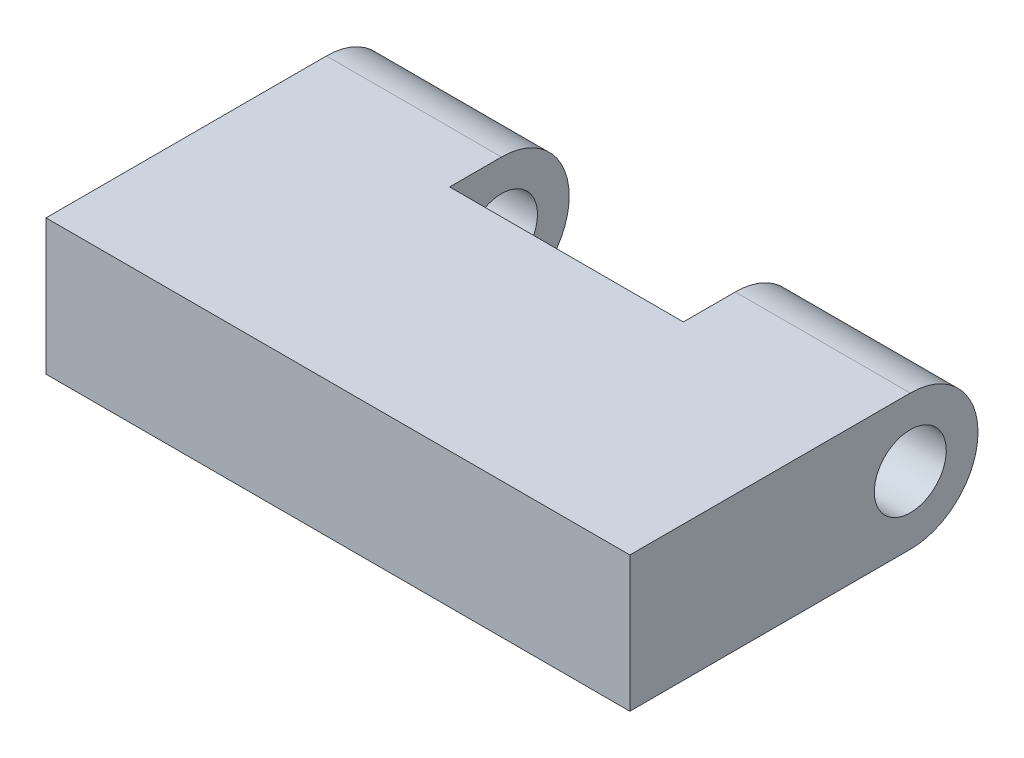
ISO-10303-21;
HEADER;
FILE_DESCRIPTION(('STEP AP214'),'2;1');
FILE_NAME('part.step','',(''),(''),'','','');
FILE_SCHEMA(('AUTOMOTIVE_DESIGN { 1 0 10303 214 1 1 1 1 }'));
ENDSEC;
DATA;
#1=APPLICATION_CONTEXT('core data for automotive mechanical design processes');
#2=APPLICATION_PROTOCOL_DEFINITION('international standard','automotive_design',2000,#1);
#3=PRODUCT_CONTEXT('',#1,'mechanical');
#4=PRODUCT('Part','Part','',(#3));
#5=PRODUCT_RELATED_PRODUCT_CATEGORY('part','',(#4));
#6=PRODUCT_DEFINITION_FORMATION('','',#4);
#7=PRODUCT_DEFINITION_CONTEXT('part definition',#1,'design');
#8=PRODUCT_DEFINITION('design','',#6,#7);
#9=PRODUCT_DEFINITION_SHAPE('','',#8);
#10=(LENGTH_UNIT() NAMED_UNIT(*) SI_UNIT(.MILLI.,.METRE.));
#11=(NAMED_UNIT(*) PLANE_ANGLE_UNIT() SI_UNIT($,.RADIAN.));
#12=(NAMED_UNIT(*) SI_UNIT($,.STERADIAN.) SOLID_ANGLE_UNIT());
#13=UNCERTAINTY_MEASURE_WITH_UNIT(LENGTH_MEASURE(1.E-05),#10,'distance_accuracy_value','');
#14=(GEOMETRIC_REPRESENTATION_CONTEXT(3) GLOBAL_UNCERTAINTY_ASSIGNED_CONTEXT((#13)) GLOBAL_UNIT_ASSIGNED_CONTEXT((#10,
#11,#12)) REPRESENTATION_CONTEXT('',''));
#15=CARTESIAN_POINT('',(0.,0.,0.));
#16=DIRECTION('',(0.,0.,1.));
#17=DIRECTION('',(1.,0.,0.));
#18=AXIS2_PLACEMENT_3D('',#15,#16,#17);
#19=CARTESIAN_POINT('',(6.67809582843404,17.5769670723901,-2.06915156237386));
#20=DIRECTION('',(1.,0.,0.));
#21=DIRECTION('',(0.,1.,0.));
#22=AXIS2_PLACEMENT_3D('',#19,#20,#21);
#23=PLANE('',#22);
#24=CARTESIAN_POINT('',(6.67809582843404,17.5769670723901,-2.06915156237386));
#25=DIRECTION('',(1.,0.,0.));
#26=DIRECTION('',(0.,1.,0.));
#27=AXIS2_PLACEMENT_3D('',#24,#25,#26);
#28=CIRCLE('',#27,2.05553129236809);
#29=CARTESIAN_POINT('',(6.67809582843404,19.6324983647582,-2.06915156237386));
#30=VERTEX_POINT('',#29);
#31=EDGE_CURVE('E149',#30,#30,#28,.T.);
#32=ORIENTED_EDGE('',*,*,#31,.T.);
#33=EDGE_LOOP('',(#32));
#34=FACE_BOUND('',#33,.T.);
#35=DIRECTION('',(0.,-1.,0.));
#36=VECTOR('',#35,1.);
#37=CARTESIAN_POINT('',(6.67809582843404,13.7097679309726,0.894908454199594));
#38=LINE('',#37,#36);
#39=CARTESIAN_POINT('',(6.67809582843404,21.4441662138076,0.894908454199594));
#40=VERTEX_POINT('',#39);
#41=CARTESIAN_POINT('',(6.67809582843404,13.7097679309726,0.894908454199594));
#42=VERTEX_POINT('',#41);
#43=EDGE_CURVE('E48',#40,#42,#38,.T.);
#44=ORIENTED_EDGE('',*,*,#43,.F.);
#45=DIRECTION('',(0.,0.,1.));
#46=VECTOR('',#45,1.);
#47=CARTESIAN_POINT('',(6.67809582843404,21.4441662138076,3.36865125823493));
#48=LINE('',#47,#46);
#49=CARTESIAN_POINT('',(6.67809582843404,21.4441662138076,-2.06915156237386));
#50=VERTEX_POINT('',#49);
#51=EDGE_CURVE('E69',#50,#40,#48,.T.);
#52=ORIENTED_EDGE('',*,*,#51,.F.);
#53=CARTESIAN_POINT('',(6.67809582843404,17.5769670723901,-2.06915156237386));
#54=DIRECTION('',(1.,0.,0.));
#55=DIRECTION('',(0.,1.,0.));
#56=AXIS2_PLACEMENT_3D('',#53,#54,#55);
#57=CIRCLE('',#56,3.86719914141752);
#58=CARTESIAN_POINT('',(6.67809582843404,13.7097679309726,-2.06915156237386));
#59=VERTEX_POINT('',#58);
#60=EDGE_CURVE('E167',#59,#50,#57,.T.);
#61=ORIENTED_EDGE('',*,*,#60,.F.);
#62=DIRECTION('',(0.,0.,-1.));
#63=VECTOR('',#62,1.);
#64=CARTESIAN_POINT('',(6.67809582843404,13.7097679309726,3.36865125823493));
#65=LINE('',#64,#63);
#66=EDGE_CURVE('E157',#42,#59,#65,.T.);
#67=ORIENTED_EDGE('',*,*,#66,.F.);
#68=EDGE_LOOP('',(#44,#52,#61,#67));
#69=FACE_BOUND('',#68,.T.);
#70=ADVANCED_FACE('F33',(#34,#69),#23,.F.);
#71=CARTESIAN_POINT('',(16.678095828434,17.5769670723901,-2.06915156237386));
#72=DIRECTION('',(1.,0.,0.));
#73=DIRECTION('',(0.,1.,0.));
#74=AXIS2_PLACEMENT_3D('',#71,#72,#73);
#75=PLANE('',#74);
#76=DIRECTION('',(0.,-1.,0.));
#77=VECTOR('',#76,1.);
#78=CARTESIAN_POINT('',(16.678095828434,21.4441662138076,13.9538431601005));
#79=LINE('',#78,#77);
#80=CARTESIAN_POINT('',(16.678095828434,21.4441662138076,13.9538431601005));
#81=VERTEX_POINT('',#80);
#82=CARTESIAN_POINT('',(16.678095828434,13.7097679309726,13.9538431601005));
#83=VERTEX_POINT('',#82);
#84=EDGE_CURVE('E160',#81,#83,#79,.T.);
#85=ORIENTED_EDGE('',*,*,#84,.T.);
#86=DIRECTION('',(0.,0.,-1.));
#87=VECTOR('',#86,1.);
#88=CARTESIAN_POINT('',(16.678095828434,13.7097679309726,3.36865125823493));
#89=LINE('',#88,#87);
#90=CARTESIAN_POINT('',(16.678095828434,13.7097679309726,-2.06915156237386));
#91=VERTEX_POINT('',#90);
#92=EDGE_CURVE('E76',#83,#91,#89,.T.);
#93=ORIENTED_EDGE('',*,*,#92,.T.);
#94=CARTESIAN_POINT('',(16.678095828434,17.5769670723901,-2.06915156237386));
#95=DIRECTION('',(1.,0.,0.));
#96=DIRECTION('',(0.,1.,0.));
#97=AXIS2_PLACEMENT_3D('',#94,#95,#96);
#98=CIRCLE('',#97,3.86719914141752);
#99=CARTESIAN_POINT('',(16.678095828434,21.4441662138076,-2.06915156237386));
#100=VERTEX_POINT('',#99);
#101=EDGE_CURVE('E163',#91,#100,#98,.T.);
#102=ORIENTED_EDGE('',*,*,#101,.T.);
#103=DIRECTION('',(0.,0.,1.));
#104=VECTOR('',#103,1.);
#105=CARTESIAN_POINT('',(16.678095828434,21.4441662138076,-2.06915156237386));
#106=LINE('',#105,#104);
#107=EDGE_CURVE('E57',#100,#81,#106,.T.);
#108=ORIENTED_EDGE('',*,*,#107,.T.);
#109=EDGE_LOOP('',(#85,#93,#102,#108));
#110=FACE_BOUND('',#109,.T.);
#111=CARTESIAN_POINT('',(16.678095828434,17.5769670723901,-2.06915156237386));
#112=DIRECTION('',(1.,0.,0.));
#113=DIRECTION('',(0.,1.,0.));
#114=AXIS2_PLACEMENT_3D('',#111,#112,#113);
#115=CIRCLE('',#114,2.05553129236809);
#116=CARTESIAN_POINT('',(16.678095828434,19.6324983647582,-2.06915156237386));
#117=VERTEX_POINT('',#116);
#118=EDGE_CURVE('E154',#117,#117,#115,.T.);
#119=ORIENTED_EDGE('',*,*,#118,.F.);
#120=EDGE_LOOP('',(#119));
#121=FACE_BOUND('',#120,.T.);
#122=ADVANCED_FACE('F190',(#110,#121),#75,.T.);
#123=CARTESIAN_POINT('',(16.678095828434,21.4441662138076,13.9538431601005));
#124=DIRECTION('',(0.,0.,-1.));
#125=DIRECTION('',(0.,1.,0.));
#126=AXIS2_PLACEMENT_3D('',#123,#124,#125);
#127=PLANE('',#126);
#128=DIRECTION('',(-1.,0.,0.));
#129=VECTOR('',#128,1.);
#130=CARTESIAN_POINT('',(16.678095828434,21.4441662138076,13.9538431601005));
#131=LINE('',#130,#129);
#132=CARTESIAN_POINT('',(-16.678095828434,21.4441662138076,13.9538431601005));
#133=VERTEX_POINT('',#132);
#134=EDGE_CURVE('E120',#81,#133,#131,.T.);
#135=ORIENTED_EDGE('',*,*,#134,.T.);
#136=DIRECTION('',(0.,-1.,0.));
#137=VECTOR('',#136,1.);
#138=CARTESIAN_POINT('',(-16.678095828434,21.4441662138076,13.9538431601005));
#139=LINE('',#138,#137);
#140=CARTESIAN_POINT('',(-16.678095828434,13.7097679309726,13.9538431601005));
#141=VERTEX_POINT('',#140);
#142=EDGE_CURVE('E116',#133,#141,#139,.T.);
#143=ORIENTED_EDGE('',*,*,#142,.T.);
#144=DIRECTION('',(-1.,0.,0.));
#145=VECTOR('',#144,1.);
#146=CARTESIAN_POINT('',(16.678095828434,13.7097679309726,13.9538431601005));
#147=LINE('',#146,#145);
#148=EDGE_CURVE('E11',#83,#141,#147,.T.);
#149=ORIENTED_EDGE('',*,*,#148,.F.);
#150=ORIENTED_EDGE('',*,*,#84,.F.);
#151=EDGE_LOOP('',(#135,#143,#149,#150));
#152=FACE_BOUND('',#151,.T.);
#153=ADVANCED_FACE('F35',(#152),#127,.F.);
#154=CARTESIAN_POINT('',(16.678095828434,13.7097679309726,3.36865125823493));
#155=DIRECTION('',(0.,1.,0.));
#156=DIRECTION('',(-1.,0.,0.));
#157=AXIS2_PLACEMENT_3D('',#154,#155,#156);
#158=PLANE('',#157);
#159=ORIENTED_EDGE('',*,*,#148,.T.);
#160=DIRECTION('',(0.,0.,-1.));
#161=VECTOR('',#160,1.);
#162=CARTESIAN_POINT('',(-16.678095828434,13.7097679309726,3.36865125823493));
#163=LINE('',#162,#161);
#164=CARTESIAN_POINT('',(-16.678095828434,13.7097679309726,-2.06915156237386));
#165=VERTEX_POINT('',#164);
#166=EDGE_CURVE('E106',#141,#165,#163,.T.);
#167=ORIENTED_EDGE('',*,*,#166,.T.);
#168=DIRECTION('',(1.,0.,0.));
#169=VECTOR('',#168,1.);
#170=CARTESIAN_POINT('',(-16.678095828434,13.7097679309726,-2.06915156237386));
#171=LINE('',#170,#169);
#172=CARTESIAN_POINT('',(-6.67809582843404,13.7097679309726,-2.06915156237386));
#173=VERTEX_POINT('',#172);
#174=EDGE_CURVE('E141',#165,#173,#171,.T.);
#175=ORIENTED_EDGE('',*,*,#174,.T.);
#176=DIRECTION('',(0.,0.,-1.));
#177=VECTOR('',#176,1.);
#178=CARTESIAN_POINT('',(-6.67809582843404,13.7097679309726,3.36865125823493));
#179=LINE('',#178,#177);
#180=CARTESIAN_POINT('',(-6.67809582843404,13.7097679309726,0.894908454199594));
#181=VERTEX_POINT('',#180);
#182=EDGE_CURVE('E135',#181,#173,#179,.T.);
#183=ORIENTED_EDGE('',*,*,#182,.F.);
#184=DIRECTION('',(1.,0.,0.));
#185=VECTOR('',#184,1.);
#186=CARTESIAN_POINT('',(-21.8556019625295,13.7097679309726,0.894908454199594));
#187=LINE('',#186,#185);
#188=EDGE_CURVE('E145',#181,#42,#187,.T.);
#189=ORIENTED_EDGE('',*,*,#188,.T.);
#190=ORIENTED_EDGE('',*,*,#66,.T.);
#191=DIRECTION('',(-1.,0.,0.));
#192=VECTOR('',#191,1.);
#193=CARTESIAN_POINT('',(16.678095828434,13.7097679309726,-2.06915156237386));
#194=LINE('',#193,#192);
#195=EDGE_CURVE('E41',#91,#59,#194,.T.);
#196=ORIENTED_EDGE('',*,*,#195,.F.);
#197=ORIENTED_EDGE('',*,*,#92,.F.);
#198=EDGE_LOOP('',(#159,#167,#175,#183,#189,#190,#196,#197));
#199=FACE_BOUND('',#198,.T.);
#200=ADVANCED_FACE('F104',(#199),#158,.F.);
#201=CARTESIAN_POINT('',(16.678095828434,17.5769670723901,-2.06915156237386));
#202=DIRECTION('',(-1.,0.,0.));
#203=DIRECTION('',(0.,-1.,0.));
#204=AXIS2_PLACEMENT_3D('',#201,#202,#203);
#205=CYLINDRICAL_SURFACE('',#204,3.86719914141752);
#206=ORIENTED_EDGE('',*,*,#60,.T.);
#207=DIRECTION('',(-1.,0.,0.));
#208=VECTOR('',#207,1.);
#209=CARTESIAN_POINT('',(16.678095828434,21.4441662138076,-2.06915156237386));
#210=LINE('',#209,#208);
#211=EDGE_CURVE('E171',#100,#50,#210,.T.);
#212=ORIENTED_EDGE('',*,*,#211,.F.);
#213=ORIENTED_EDGE('',*,*,#101,.F.);
#214=ORIENTED_EDGE('',*,*,#195,.T.);
#215=EDGE_LOOP('',(#206,#212,#213,#214));
#216=FACE_BOUND('',#215,.T.);
#217=ADVANCED_FACE('F176',(#216),#205,.T.);
#218=CARTESIAN_POINT('',(16.678095828434,21.4441662138076,3.36865125823493));
#219=DIRECTION('',(0.,-1.,0.));
#220=DIRECTION('',(1.,0.,0.));
#221=AXIS2_PLACEMENT_3D('',#218,#219,#220);
#222=PLANE('',#221);
#223=ORIENTED_EDGE('',*,*,#51,.T.);
#224=DIRECTION('',(1.,0.,0.));
#225=VECTOR('',#224,1.);
#226=CARTESIAN_POINT('',(-21.8556019625295,21.4441662138076,0.894908454199594));
#227=LINE('',#226,#225);
#228=CARTESIAN_POINT('',(-6.67809582843404,21.4441662138076,0.894908454199594));
#229=VERTEX_POINT('',#228);
#230=EDGE_CURVE('E143',#229,#40,#227,.T.);
#231=ORIENTED_EDGE('',*,*,#230,.F.);
#232=DIRECTION('',(0.,0.,1.));
#233=VECTOR('',#232,1.);
#234=CARTESIAN_POINT('',(-6.67809582843404,21.4441662138076,3.36865125823493));
#235=LINE('',#234,#233);
#236=CARTESIAN_POINT('',(-6.67809582843404,21.4441662138076,-2.06915156237386));
#237=VERTEX_POINT('',#236);
#238=EDGE_CURVE('E122',#237,#229,#235,.T.);
#239=ORIENTED_EDGE('',*,*,#238,.F.);
#240=DIRECTION('',(1.,0.,0.));
#241=VECTOR('',#240,1.);
#242=CARTESIAN_POINT('',(-16.678095828434,21.4441662138076,-2.06915156237386));
#243=LINE('',#242,#241);
#244=CARTESIAN_POINT('',(-16.678095828434,21.4441662138076,-2.06915156237386));
#245=VERTEX_POINT('',#244);
#246=EDGE_CURVE('E134',#245,#237,#243,.T.);
#247=ORIENTED_EDGE('',*,*,#246,.F.);
#248=DIRECTION('',(0.,0.,1.));
#249=VECTOR('',#248,1.);
#250=CARTESIAN_POINT('',(-16.678095828434,21.4441662138076,-2.06915156237386));
#251=LINE('',#250,#249);
#252=EDGE_CURVE('E132',#245,#133,#251,.T.);
#253=ORIENTED_EDGE('',*,*,#252,.T.);
#254=ORIENTED_EDGE('',*,*,#134,.F.);
#255=ORIENTED_EDGE('',*,*,#107,.F.);
#256=ORIENTED_EDGE('',*,*,#211,.T.);
#257=EDGE_LOOP('',(#223,#231,#239,#247,#253,#254,#255,#256));
#258=FACE_BOUND('',#257,.T.);
#259=ADVANCED_FACE('F184',(#258),#222,.F.);
#260=CARTESIAN_POINT('',(16.678095828434,17.5769670723901,-2.06915156237386));
#261=DIRECTION('',(-1.,0.,0.));
#262=DIRECTION('',(0.,-1.,0.));
#263=AXIS2_PLACEMENT_3D('',#260,#261,#262);
#264=CYLINDRICAL_SURFACE('',#263,2.05553129236809);
#265=ORIENTED_EDGE('',*,*,#118,.T.);
#266=EDGE_LOOP('',(#265));
#267=FACE_BOUND('',#266,.T.);
#268=ORIENTED_EDGE('',*,*,#31,.F.);
#269=EDGE_LOOP('',(#268));
#270=FACE_BOUND('',#269,.T.);
#271=ADVANCED_FACE('F196',(#267,#270),#264,.F.);
#272=CARTESIAN_POINT('',(-21.8556019625295,13.7097679309726,0.894908454199594));
#273=DIRECTION('',(0.,0.,1.));
#274=DIRECTION('',(1.,0.,0.));
#275=AXIS2_PLACEMENT_3D('',#272,#273,#274);
#276=PLANE('',#275);
#277=DIRECTION('',(0.,-1.,0.));
#278=VECTOR('',#277,1.);
#279=CARTESIAN_POINT('',(-6.67809582843404,13.7097679309726,0.894908454199594));
#280=LINE('',#279,#278);
#281=EDGE_CURVE('E146',#229,#181,#280,.T.);
#282=ORIENTED_EDGE('',*,*,#281,.F.);
#283=ORIENTED_EDGE('',*,*,#230,.T.);
#284=ORIENTED_EDGE('',*,*,#43,.T.);
#285=ORIENTED_EDGE('',*,*,#188,.F.);
#286=EDGE_LOOP('',(#282,#283,#284,#285));
#287=FACE_BOUND('',#286,.T.);
#288=ADVANCED_FACE('F180',(#287),#276,.F.);
#289=CARTESIAN_POINT('',(-6.67809582843404,17.5769670723901,-2.06915156237386));
#290=DIRECTION('',(-1.,0.,0.));
#291=DIRECTION('',(0.,1.,0.));
#292=AXIS2_PLACEMENT_3D('',#289,#290,#291);
#293=PLANE('',#292);
#294=CARTESIAN_POINT('',(-6.67809582843404,17.5769670723901,-2.06915156237386));
#295=DIRECTION('',(1.,0.,0.));
#296=DIRECTION('',(0.,1.,0.));
#297=AXIS2_PLACEMENT_3D('',#294,#295,#296);
#298=CIRCLE('',#297,2.05553129236809);
#299=CARTESIAN_POINT('',(-6.67809582843404,19.6324983647582,-2.06915156237386));
#300=VERTEX_POINT('',#299);
#301=EDGE_CURVE('E128',#300,#300,#298,.T.);
#302=ORIENTED_EDGE('',*,*,#301,.F.);
#303=EDGE_LOOP('',(#302));
#304=FACE_BOUND('',#303,.T.);
#305=ORIENTED_EDGE('',*,*,#238,.T.);
#306=ORIENTED_EDGE('',*,*,#281,.T.);
#307=ORIENTED_EDGE('',*,*,#182,.T.);
#308=CARTESIAN_POINT('',(-6.67809582843404,17.5769670723901,-2.06915156237386));
#309=DIRECTION('',(1.,0.,0.));
#310=DIRECTION('',(0.,1.,0.));
#311=AXIS2_PLACEMENT_3D('',#308,#309,#310);
#312=CIRCLE('',#311,3.86719914141752);
#313=EDGE_CURVE('E125',#173,#237,#312,.T.);
#314=ORIENTED_EDGE('',*,*,#313,.T.);
#315=EDGE_LOOP('',(#305,#306,#307,#314));
#316=FACE_BOUND('',#315,.T.);
#317=ADVANCED_FACE('F186',(#304,#316),#293,.F.);
#318=CARTESIAN_POINT('',(-16.678095828434,17.5769670723901,-2.06915156237386));
#319=DIRECTION('',(-1.,0.,0.));
#320=DIRECTION('',(0.,1.,0.));
#321=AXIS2_PLACEMENT_3D('',#318,#319,#320);
#322=PLANE('',#321);
#323=ORIENTED_EDGE('',*,*,#142,.F.);
#324=ORIENTED_EDGE('',*,*,#252,.F.);
#325=CARTESIAN_POINT('',(-16.678095828434,17.5769670723901,-2.06915156237386));
#326=DIRECTION('',(1.,0.,0.));
#327=DIRECTION('',(0.,1.,0.));
#328=AXIS2_PLACEMENT_3D('',#325,#326,#327);
#329=CIRCLE('',#328,3.86719914141752);
#330=EDGE_CURVE('E118',#165,#245,#329,.T.);
#331=ORIENTED_EDGE('',*,*,#330,.F.);
#332=ORIENTED_EDGE('',*,*,#166,.F.);
#333=EDGE_LOOP('',(#323,#324,#331,#332));
#334=FACE_BOUND('',#333,.T.);
#335=CARTESIAN_POINT('',(-16.678095828434,17.5769670723901,-2.06915156237386));
#336=DIRECTION('',(1.,0.,0.));
#337=DIRECTION('',(0.,1.,0.));
#338=AXIS2_PLACEMENT_3D('',#335,#336,#337);
#339=CIRCLE('',#338,2.05553129236809);
#340=CARTESIAN_POINT('',(-16.678095828434,19.6324983647582,-2.06915156237386));
#341=VERTEX_POINT('',#340);
#342=EDGE_CURVE('E137',#341,#341,#339,.T.);
#343=ORIENTED_EDGE('',*,*,#342,.T.);
#344=EDGE_LOOP('',(#343));
#345=FACE_BOUND('',#344,.T.);
#346=ADVANCED_FACE('F113',(#334,#345),#322,.T.);
#347=CARTESIAN_POINT('',(-16.678095828434,17.5769670723901,-2.06915156237386));
#348=DIRECTION('',(1.,0.,0.));
#349=DIRECTION('',(0.,-1.,0.));
#350=AXIS2_PLACEMENT_3D('',#347,#348,#349);
#351=CYLINDRICAL_SURFACE('',#350,3.86719914141752);
#352=ORIENTED_EDGE('',*,*,#313,.F.);
#353=ORIENTED_EDGE('',*,*,#174,.F.);
#354=ORIENTED_EDGE('',*,*,#330,.T.);
#355=ORIENTED_EDGE('',*,*,#246,.T.);
#356=EDGE_LOOP('',(#352,#353,#354,#355));
#357=FACE_BOUND('',#356,.T.);
#358=ADVANCED_FACE('F189',(#357),#351,.T.);
#359=CARTESIAN_POINT('',(-16.678095828434,17.5769670723901,-2.06915156237386));
#360=DIRECTION('',(1.,0.,0.));
#361=DIRECTION('',(0.,-1.,0.));
#362=AXIS2_PLACEMENT_3D('',#359,#360,#361);
#363=CYLINDRICAL_SURFACE('',#362,2.05553129236809);
#364=ORIENTED_EDGE('',*,*,#342,.F.);
#365=EDGE_LOOP('',(#364));
#366=FACE_BOUND('',#365,.T.);
#367=ORIENTED_EDGE('',*,*,#301,.T.);
#368=EDGE_LOOP('',(#367));
#369=FACE_BOUND('',#368,.T.);
#370=ADVANCED_FACE('F267',(#366,#369),#363,.F.);
#371=CLOSED_SHELL('',(#70,#122,#153,#200,#217,#259,#271,#288,#317,#346,#358,#370));
#372=MANIFOLD_SOLID_BREP('B2',#371);
#373=ADVANCED_BREP_SHAPE_REPRESENTATION('',(#18,#372),#14);
#374=SHAPE_DEFINITION_REPRESENTATION(#9,#373);
ENDSEC;
END-ISO-10303-21;
